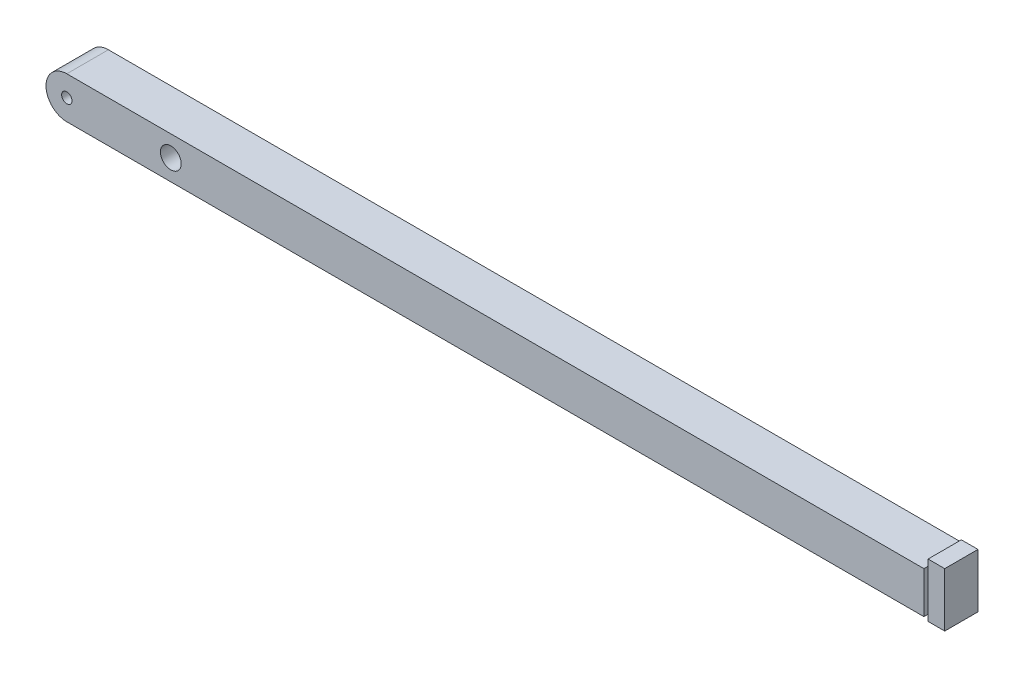
ISO-10303-21;
HEADER;
FILE_DESCRIPTION(('STEP AP214'),'2;1');
FILE_NAME('part.step','',(''),(''),'','','');
FILE_SCHEMA(('AUTOMOTIVE_DESIGN { 1 0 10303 214 1 1 1 1 }'));
ENDSEC;
DATA;
#1=APPLICATION_CONTEXT('core data for automotive mechanical design processes');
#2=APPLICATION_PROTOCOL_DEFINITION('international standard','automotive_design',2000,#1);
#3=PRODUCT_CONTEXT('',#1,'mechanical');
#4=PRODUCT('Part','Part','',(#3));
#5=PRODUCT_RELATED_PRODUCT_CATEGORY('part','',(#4));
#6=PRODUCT_DEFINITION_FORMATION('','',#4);
#7=PRODUCT_DEFINITION_CONTEXT('part definition',#1,'design');
#8=PRODUCT_DEFINITION('design','',#6,#7);
#9=PRODUCT_DEFINITION_SHAPE('','',#8);
#10=(LENGTH_UNIT() NAMED_UNIT(*) SI_UNIT(.MILLI.,.METRE.));
#11=(NAMED_UNIT(*) PLANE_ANGLE_UNIT() SI_UNIT($,.RADIAN.));
#12=(NAMED_UNIT(*) SI_UNIT($,.STERADIAN.) SOLID_ANGLE_UNIT());
#13=UNCERTAINTY_MEASURE_WITH_UNIT(LENGTH_MEASURE(1.E-05),#10,'distance_accuracy_value','');
#14=(GEOMETRIC_REPRESENTATION_CONTEXT(3) GLOBAL_UNCERTAINTY_ASSIGNED_CONTEXT((#13)) GLOBAL_UNIT_ASSIGNED_CONTEXT((#10,
#11,#12)) REPRESENTATION_CONTEXT('',''));
#15=CARTESIAN_POINT('',(0.,0.,0.));
#16=DIRECTION('',(0.,0.,1.));
#17=DIRECTION('',(1.,0.,0.));
#18=AXIS2_PLACEMENT_3D('',#15,#16,#17);
#19=CARTESIAN_POINT('',(0.,7.67322510324858E-12,12.7));
#20=DIRECTION('',(0.,1.,0.));
#21=DIRECTION('',(0.,0.,1.));
#22=AXIS2_PLACEMENT_3D('',#19,#20,#21);
#23=PLANE('',#22);
#24=DIRECTION('',(0.,0.,-1.));
#25=VECTOR('',#24,1.);
#26=CARTESIAN_POINT('',(599.440000000133,7.67322510074029E-12,0.));
#27=LINE('',#26,#25);
#28=CARTESIAN_POINT('',(599.440000000133,7.67322510074029E-12,10.16));
#29=VERTEX_POINT('',#28);
#30=CARTESIAN_POINT('',(599.440000000133,7.67322510074029E-12,-10.16));
#31=VERTEX_POINT('',#30);
#32=EDGE_CURVE('E135',#29,#31,#27,.T.);
#33=ORIENTED_EDGE('',*,*,#32,.F.);
#34=DIRECTION('',(0.,0.,-1.));
#35=VECTOR('',#34,1.);
#36=CARTESIAN_POINT('',(599.440000000133,7.67322510074029E-12,0.));
#37=LINE('',#36,#35);
#38=CARTESIAN_POINT('',(599.440000000133,7.67322510074029E-12,12.7));
#39=VERTEX_POINT('',#38);
#40=EDGE_CURVE('E177',#39,#29,#37,.T.);
#41=ORIENTED_EDGE('',*,*,#40,.F.);
#42=DIRECTION('',(1.,0.,0.));
#43=VECTOR('',#42,1.);
#44=CARTESIAN_POINT('',(0.,7.67322510324858E-12,12.7));
#45=LINE('',#44,#43);
#46=CARTESIAN_POINT('',(76.200000000133,7.237033291704E-11,12.7));
#47=VERTEX_POINT('',#46);
#48=EDGE_CURVE('E203',#47,#39,#45,.T.);
#49=ORIENTED_EDGE('',*,*,#48,.F.);
#50=DIRECTION('',(0.,0.,-1.));
#51=VECTOR('',#50,1.);
#52=CARTESIAN_POINT('',(76.200000000133,7.237033291704E-11,12.7));
#53=LINE('',#52,#51);
#54=CARTESIAN_POINT('',(76.200000000133,7.237033291704E-11,-12.7));
#55=VERTEX_POINT('',#54);
#56=EDGE_CURVE('E46',#47,#55,#53,.T.);
#57=ORIENTED_EDGE('',*,*,#56,.T.);
#58=DIRECTION('',(1.,0.,0.));
#59=VECTOR('',#58,1.);
#60=CARTESIAN_POINT('',(0.,7.67322510324858E-12,-12.7));
#61=LINE('',#60,#59);
#62=CARTESIAN_POINT('',(599.440000000133,7.67322510324858E-12,-12.7));
#63=VERTEX_POINT('',#62);
#64=EDGE_CURVE('E201',#55,#63,#61,.T.);
#65=ORIENTED_EDGE('',*,*,#64,.T.);
#66=DIRECTION('',(0.,0.,-1.));
#67=VECTOR('',#66,1.);
#68=CARTESIAN_POINT('',(599.440000000133,7.67322510074029E-12,0.));
#69=LINE('',#68,#67);
#70=EDGE_CURVE('E53',#31,#63,#69,.T.);
#71=ORIENTED_EDGE('',*,*,#70,.F.);
#72=EDGE_LOOP('',(#33,#41,#49,#57,#65,#71));
#73=FACE_BOUND('',#72,.T.);
#74=ADVANCED_FACE('F38',(#73),#23,.F.);
#75=CARTESIAN_POINT('',(1.28508315100596E-11,25.4000000000462,12.7));
#76=DIRECTION('',(5.05938248426622E-13,1.,0.));
#77=DIRECTION('',(-1.,5.05938248426622E-13,0.));
#78=AXIS2_PLACEMENT_3D('',#75,#76,#77);
#79=PLANE('',#78);
#80=DIRECTION('',(0.,0.,1.));
#81=VECTOR('',#80,1.);
#82=CARTESIAN_POINT('',(599.440000000133,25.4000000000077,0.));
#83=LINE('',#82,#81);
#84=CARTESIAN_POINT('',(599.440000000133,25.4000000000077,10.16));
#85=VERTEX_POINT('',#84);
#86=CARTESIAN_POINT('',(599.440000000133,25.399999999743,12.7));
#87=VERTEX_POINT('',#86);
#88=EDGE_CURVE('E61',#85,#87,#83,.T.);
#89=ORIENTED_EDGE('',*,*,#88,.F.);
#90=DIRECTION('',(0.,0.,1.));
#91=VECTOR('',#90,1.);
#92=CARTESIAN_POINT('',(599.440000000133,25.4000000000077,0.));
#93=LINE('',#92,#91);
#94=CARTESIAN_POINT('',(599.440000000133,25.4000000000077,-10.16));
#95=VERTEX_POINT('',#94);
#96=EDGE_CURVE('E147',#95,#85,#93,.T.);
#97=ORIENTED_EDGE('',*,*,#96,.F.);
#98=DIRECTION('',(0.,0.,1.));
#99=VECTOR('',#98,1.);
#100=CARTESIAN_POINT('',(599.440000000133,25.4000000000077,0.));
#101=LINE('',#100,#99);
#102=CARTESIAN_POINT('',(599.440000000133,25.4000000000077,-12.7));
#103=VERTEX_POINT('',#102);
#104=EDGE_CURVE('E172',#103,#95,#101,.T.);
#105=ORIENTED_EDGE('',*,*,#104,.F.);
#106=DIRECTION('',(1.,-5.05938248426622E-13,0.));
#107=VECTOR('',#106,1.);
#108=CARTESIAN_POINT('',(1.28508315100596E-11,25.4000000000462,-12.7));
#109=LINE('',#108,#107);
#110=CARTESIAN_POINT('',(76.200000000133,25.399999999943,-12.7));
#111=VERTEX_POINT('',#110);
#112=EDGE_CURVE('E194',#111,#103,#109,.T.);
#113=ORIENTED_EDGE('',*,*,#112,.F.);
#114=DIRECTION('',(0.,0.,-1.));
#115=VECTOR('',#114,1.);
#116=CARTESIAN_POINT('',(76.200000000133,25.399999999943,12.7));
#117=LINE('',#116,#115);
#118=CARTESIAN_POINT('',(76.200000000133,25.399999999943,12.7));
#119=VERTEX_POINT('',#118);
#120=EDGE_CURVE('E12',#119,#111,#117,.T.);
#121=ORIENTED_EDGE('',*,*,#120,.F.);
#122=DIRECTION('',(1.,-5.05938248426622E-13,0.));
#123=VECTOR('',#122,1.);
#124=CARTESIAN_POINT('',(1.28508315100596E-11,25.4000000000462,12.7));
#125=LINE('',#124,#123);
#126=EDGE_CURVE('E197',#119,#87,#125,.T.);
#127=ORIENTED_EDGE('',*,*,#126,.T.);
#128=EDGE_LOOP('',(#89,#97,#105,#113,#121,#127));
#129=FACE_BOUND('',#128,.T.);
#130=ADVANCED_FACE('F40',(#129),#79,.T.);
#131=CARTESIAN_POINT('',(609.600000000133,0.,12.7));
#132=DIRECTION('',(1.,0.,0.));
#133=DIRECTION('',(0.,0.,-1.));
#134=AXIS2_PLACEMENT_3D('',#131,#132,#133);
#135=PLANE('',#134);
#136=DIRECTION('',(0.,1.,0.));
#137=VECTOR('',#136,1.);
#138=CARTESIAN_POINT('',(609.600000000133,0.,10.16));
#139=LINE('',#138,#137);
#140=CARTESIAN_POINT('',(609.600000000133,-3.81,10.16));
#141=VERTEX_POINT('',#140);
#142=CARTESIAN_POINT('',(609.600000000133,29.2100000000077,10.16));
#143=VERTEX_POINT('',#142);
#144=EDGE_CURVE('E175',#141,#143,#139,.T.);
#145=ORIENTED_EDGE('',*,*,#144,.F.);
#146=DIRECTION('',(0.,0.,-1.));
#147=VECTOR('',#146,1.);
#148=CARTESIAN_POINT('',(609.600000000133,-3.81,0.));
#149=LINE('',#148,#147);
#150=CARTESIAN_POINT('',(609.600000000133,-3.81,-10.16));
#151=VERTEX_POINT('',#150);
#152=EDGE_CURVE('E123',#141,#151,#149,.T.);
#153=ORIENTED_EDGE('',*,*,#152,.T.);
#154=DIRECTION('',(0.,1.,0.));
#155=VECTOR('',#154,1.);
#156=CARTESIAN_POINT('',(609.600000000133,0.,-10.16));
#157=LINE('',#156,#155);
#158=CARTESIAN_POINT('',(609.600000000133,29.2100000000077,-10.16));
#159=VERTEX_POINT('',#158);
#160=EDGE_CURVE('E163',#151,#159,#157,.T.);
#161=ORIENTED_EDGE('',*,*,#160,.T.);
#162=DIRECTION('',(0.,0.,-1.));
#163=VECTOR('',#162,1.);
#164=CARTESIAN_POINT('',(609.600000000133,29.2100000000077,0.));
#165=LINE('',#164,#163);
#166=EDGE_CURVE('E145',#143,#159,#165,.T.);
#167=ORIENTED_EDGE('',*,*,#166,.F.);
#168=EDGE_LOOP('',(#145,#153,#161,#167));
#169=FACE_BOUND('',#168,.T.);
#170=ADVANCED_FACE('F251',(#169),#135,.T.);
#171=CARTESIAN_POINT('',(0.,0.,-12.7));
#172=DIRECTION('',(0.,0.,1.));
#173=DIRECTION('',(1.,0.,0.));
#174=AXIS2_PLACEMENT_3D('',#171,#172,#173);
#175=PLANE('',#174);
#176=CARTESIAN_POINT('',(76.200000000133,12.7000000000077,-12.7));
#177=DIRECTION('',(0.,0.,1.));
#178=DIRECTION('',(1.,0.,0.));
#179=AXIS2_PLACEMENT_3D('',#176,#177,#178);
#180=CIRCLE('',#179,3.1749999998706);
#181=CARTESIAN_POINT('',(79.3750000000036,12.7000000000077,-12.7));
#182=VERTEX_POINT('',#181);
#183=EDGE_CURVE('E191',#182,#182,#180,.T.);
#184=ORIENTED_EDGE('',*,*,#183,.T.);
#185=EDGE_LOOP('',(#184));
#186=FACE_BOUND('',#185,.T.);
#187=CARTESIAN_POINT('',(139.699994311699,12.6999999999768,-12.7));
#188=DIRECTION('',(0.,0.,1.));
#189=DIRECTION('',(1.,0.,0.));
#190=AXIS2_PLACEMENT_3D('',#187,#188,#189);
#191=CIRCLE('',#190,6.35);
#192=CARTESIAN_POINT('',(146.049994311699,12.6999999999768,-12.7));
#193=VERTEX_POINT('',#192);
#194=EDGE_CURVE('E183',#193,#193,#191,.T.);
#195=ORIENTED_EDGE('',*,*,#194,.T.);
#196=EDGE_LOOP('',(#195));
#197=FACE_BOUND('',#196,.T.);
#198=DIRECTION('',(0.,1.,0.));
#199=VECTOR('',#198,1.);
#200=CARTESIAN_POINT('',(599.440000000133,0.,-12.7));
#201=LINE('',#200,#199);
#202=EDGE_CURVE('E170',#63,#103,#201,.T.);
#203=ORIENTED_EDGE('',*,*,#202,.F.);
#204=ORIENTED_EDGE('',*,*,#64,.F.);
#205=CARTESIAN_POINT('',(76.200000000133,12.7000000000077,-12.7));
#206=DIRECTION('',(0.,0.,1.));
#207=DIRECTION('',(1.,0.,0.));
#208=AXIS2_PLACEMENT_3D('',#205,#206,#207);
#209=CIRCLE('',#208,12.6999999998706);
#210=EDGE_CURVE('E208',#111,#55,#209,.T.);
#211=ORIENTED_EDGE('',*,*,#210,.F.);
#212=ORIENTED_EDGE('',*,*,#112,.T.);
#213=EDGE_LOOP('',(#203,#204,#211,#212));
#214=FACE_BOUND('',#213,.T.);
#215=ADVANCED_FACE('F221',(#186,#197,#214),#175,.F.);
#216=CARTESIAN_POINT('',(0.,0.,12.7));
#217=DIRECTION('',(0.,0.,1.));
#218=DIRECTION('',(1.,0.,0.));
#219=AXIS2_PLACEMENT_3D('',#216,#217,#218);
#220=PLANE('',#219);
#221=CARTESIAN_POINT('',(76.200000000133,12.7000000000077,12.7));
#222=DIRECTION('',(0.,0.,1.));
#223=DIRECTION('',(1.,0.,0.));
#224=AXIS2_PLACEMENT_3D('',#221,#222,#223);
#225=CIRCLE('',#224,3.1749999998706);
#226=CARTESIAN_POINT('',(79.3750000000036,12.7000000000077,12.7));
#227=VERTEX_POINT('',#226);
#228=EDGE_CURVE('E188',#227,#227,#225,.T.);
#229=ORIENTED_EDGE('',*,*,#228,.F.);
#230=EDGE_LOOP('',(#229));
#231=FACE_BOUND('',#230,.T.);
#232=CARTESIAN_POINT('',(139.699994311699,12.6999999999768,12.7));
#233=DIRECTION('',(0.,0.,1.));
#234=DIRECTION('',(1.,0.,0.));
#235=AXIS2_PLACEMENT_3D('',#232,#233,#234);
#236=CIRCLE('',#235,6.35);
#237=CARTESIAN_POINT('',(146.049994311699,12.6999999999768,12.7));
#238=VERTEX_POINT('',#237);
#239=EDGE_CURVE('E185',#238,#238,#236,.T.);
#240=ORIENTED_EDGE('',*,*,#239,.F.);
#241=EDGE_LOOP('',(#240));
#242=FACE_BOUND('',#241,.T.);
#243=ORIENTED_EDGE('',*,*,#48,.T.);
#244=DIRECTION('',(0.,-1.,0.));
#245=VECTOR('',#244,1.);
#246=CARTESIAN_POINT('',(599.440000000133,0.,12.7));
#247=LINE('',#246,#245);
#248=EDGE_CURVE('E181',#87,#39,#247,.T.);
#249=ORIENTED_EDGE('',*,*,#248,.F.);
#250=ORIENTED_EDGE('',*,*,#126,.F.);
#251=CARTESIAN_POINT('',(76.200000000133,12.7000000000077,12.7));
#252=DIRECTION('',(0.,0.,1.));
#253=DIRECTION('',(1.,0.,0.));
#254=AXIS2_PLACEMENT_3D('',#251,#252,#253);
#255=CIRCLE('',#254,12.6999999998706);
#256=EDGE_CURVE('E200',#119,#47,#255,.T.);
#257=ORIENTED_EDGE('',*,*,#256,.T.);
#258=EDGE_LOOP('',(#243,#249,#250,#257));
#259=FACE_BOUND('',#258,.T.);
#260=ADVANCED_FACE('F232',(#231,#242,#259),#220,.T.);
#261=CARTESIAN_POINT('',(76.200000000133,12.7000000000077,12.7));
#262=DIRECTION('',(0.,0.,-1.));
#263=DIRECTION('',(-1.,0.,0.));
#264=AXIS2_PLACEMENT_3D('',#261,#262,#263);
#265=CYLINDRICAL_SURFACE('',#264,12.6999999998706);
#266=ORIENTED_EDGE('',*,*,#210,.T.);
#267=ORIENTED_EDGE('',*,*,#56,.F.);
#268=ORIENTED_EDGE('',*,*,#256,.F.);
#269=ORIENTED_EDGE('',*,*,#120,.T.);
#270=EDGE_LOOP('',(#266,#267,#268,#269));
#271=FACE_BOUND('',#270,.T.);
#272=ADVANCED_FACE('F234',(#271),#265,.T.);
#273=CARTESIAN_POINT('',(76.200000000133,12.7000000000077,-12.7));
#274=DIRECTION('',(0.,0.,1.));
#275=DIRECTION('',(1.,0.,0.));
#276=AXIS2_PLACEMENT_3D('',#273,#274,#275);
#277=CYLINDRICAL_SURFACE('',#276,3.1749999998706);
#278=ORIENTED_EDGE('',*,*,#183,.F.);
#279=EDGE_LOOP('',(#278));
#280=FACE_BOUND('',#279,.T.);
#281=ORIENTED_EDGE('',*,*,#228,.T.);
#282=EDGE_LOOP('',(#281));
#283=FACE_BOUND('',#282,.T.);
#284=ADVANCED_FACE('F236',(#280,#283),#277,.F.);
#285=CARTESIAN_POINT('',(139.699994311699,12.6999999999768,-12.7));
#286=DIRECTION('',(0.,0.,1.));
#287=DIRECTION('',(1.,0.,0.));
#288=AXIS2_PLACEMENT_3D('',#285,#286,#287);
#289=CYLINDRICAL_SURFACE('',#288,6.35);
#290=ORIENTED_EDGE('',*,*,#194,.F.);
#291=EDGE_LOOP('',(#290));
#292=FACE_BOUND('',#291,.T.);
#293=ORIENTED_EDGE('',*,*,#239,.T.);
#294=EDGE_LOOP('',(#293));
#295=FACE_BOUND('',#294,.T.);
#296=ADVANCED_FACE('F241',(#292,#295),#289,.F.);
#297=CARTESIAN_POINT('',(599.440000000133,0.,10.16));
#298=DIRECTION('',(0.,0.,-1.));
#299=DIRECTION('',(-1.,0.,0.));
#300=AXIS2_PLACEMENT_3D('',#297,#298,#299);
#301=PLANE('',#300);
#302=ORIENTED_EDGE('',*,*,#144,.T.);
#303=DIRECTION('',(1.,0.,0.));
#304=VECTOR('',#303,1.);
#305=CARTESIAN_POINT('',(599.440000000133,29.2100000000077,10.16));
#306=LINE('',#305,#304);
#307=CARTESIAN_POINT('',(599.440000000133,29.2100000000077,10.16));
#308=VERTEX_POINT('',#307);
#309=EDGE_CURVE('E160',#308,#143,#306,.T.);
#310=ORIENTED_EDGE('',*,*,#309,.F.);
#311=DIRECTION('',(0.,1.,0.));
#312=VECTOR('',#311,1.);
#313=CARTESIAN_POINT('',(599.440000000133,0.,10.16));
#314=LINE('',#313,#312);
#315=EDGE_CURVE('E155',#85,#308,#314,.T.);
#316=ORIENTED_EDGE('',*,*,#315,.F.);
#317=DIRECTION('',(0.,1.,0.));
#318=VECTOR('',#317,1.);
#319=CARTESIAN_POINT('',(599.440000000133,0.,10.16));
#320=LINE('',#319,#318);
#321=EDGE_CURVE('E131',#29,#85,#320,.T.);
#322=ORIENTED_EDGE('',*,*,#321,.F.);
#323=DIRECTION('',(0.,-1.,0.));
#324=VECTOR('',#323,1.);
#325=CARTESIAN_POINT('',(599.440000000133,0.,10.16));
#326=LINE('',#325,#324);
#327=CARTESIAN_POINT('',(599.440000000133,-3.81,10.16));
#328=VERTEX_POINT('',#327);
#329=EDGE_CURVE('E129',#29,#328,#326,.T.);
#330=ORIENTED_EDGE('',*,*,#329,.T.);
#331=DIRECTION('',(1.,0.,0.));
#332=VECTOR('',#331,1.);
#333=CARTESIAN_POINT('',(599.440000000133,-3.81,10.16));
#334=LINE('',#333,#332);
#335=EDGE_CURVE('E116',#328,#141,#334,.T.);
#336=ORIENTED_EDGE('',*,*,#335,.T.);
#337=EDGE_LOOP('',(#302,#310,#316,#322,#330,#336));
#338=FACE_BOUND('',#337,.T.);
#339=ADVANCED_FACE('F130',(#338),#301,.F.);
#340=CARTESIAN_POINT('',(599.440000000133,0.,0.));
#341=DIRECTION('',(1.,0.,0.));
#342=DIRECTION('',(0.,0.,-1.));
#343=AXIS2_PLACEMENT_3D('',#340,#341,#342);
#344=PLANE('',#343);
#345=ORIENTED_EDGE('',*,*,#40,.T.);
#346=ORIENTED_EDGE('',*,*,#321,.T.);
#347=ORIENTED_EDGE('',*,*,#88,.T.);
#348=ORIENTED_EDGE('',*,*,#248,.T.);
#349=EDGE_LOOP('',(#345,#346,#347,#348));
#350=FACE_BOUND('',#349,.T.);
#351=ADVANCED_FACE('F264',(#350),#344,.T.);
#352=CARTESIAN_POINT('',(599.440000000133,0.,-10.16));
#353=DIRECTION('',(0.,0.,-1.));
#354=DIRECTION('',(-1.,0.,0.));
#355=AXIS2_PLACEMENT_3D('',#352,#353,#354);
#356=PLANE('',#355);
#357=ORIENTED_EDGE('',*,*,#160,.F.);
#358=DIRECTION('',(1.,0.,0.));
#359=VECTOR('',#358,1.);
#360=CARTESIAN_POINT('',(599.440000000133,-3.81,-10.16));
#361=LINE('',#360,#359);
#362=CARTESIAN_POINT('',(599.440000000133,-3.81,-10.16));
#363=VERTEX_POINT('',#362);
#364=EDGE_CURVE('E125',#363,#151,#361,.T.);
#365=ORIENTED_EDGE('',*,*,#364,.F.);
#366=DIRECTION('',(0.,-1.,0.));
#367=VECTOR('',#366,1.);
#368=CARTESIAN_POINT('',(599.440000000133,0.,-10.16));
#369=LINE('',#368,#367);
#370=EDGE_CURVE('E139',#31,#363,#369,.T.);
#371=ORIENTED_EDGE('',*,*,#370,.F.);
#372=DIRECTION('',(0.,1.,0.));
#373=VECTOR('',#372,1.);
#374=CARTESIAN_POINT('',(599.440000000133,0.,-10.16));
#375=LINE('',#374,#373);
#376=EDGE_CURVE('E166',#31,#95,#375,.T.);
#377=ORIENTED_EDGE('',*,*,#376,.T.);
#378=DIRECTION('',(0.,1.,0.));
#379=VECTOR('',#378,1.);
#380=CARTESIAN_POINT('',(599.440000000133,0.,-10.16));
#381=LINE('',#380,#379);
#382=CARTESIAN_POINT('',(599.440000000133,29.2100000000077,-10.16));
#383=VERTEX_POINT('',#382);
#384=EDGE_CURVE('E150',#95,#383,#381,.T.);
#385=ORIENTED_EDGE('',*,*,#384,.T.);
#386=DIRECTION('',(1.,0.,0.));
#387=VECTOR('',#386,1.);
#388=CARTESIAN_POINT('',(599.440000000133,29.2100000000077,-10.16));
#389=LINE('',#388,#387);
#390=EDGE_CURVE('E157',#383,#159,#389,.T.);
#391=ORIENTED_EDGE('',*,*,#390,.T.);
#392=EDGE_LOOP('',(#357,#365,#371,#377,#385,#391));
#393=FACE_BOUND('',#392,.T.);
#394=ADVANCED_FACE('F229',(#393),#356,.T.);
#395=CARTESIAN_POINT('',(599.440000000133,0.,0.));
#396=DIRECTION('',(1.,0.,0.));
#397=DIRECTION('',(0.,0.,-1.));
#398=AXIS2_PLACEMENT_3D('',#395,#396,#397);
#399=PLANE('',#398);
#400=ORIENTED_EDGE('',*,*,#376,.F.);
#401=ORIENTED_EDGE('',*,*,#70,.T.);
#402=ORIENTED_EDGE('',*,*,#202,.T.);
#403=ORIENTED_EDGE('',*,*,#104,.T.);
#404=EDGE_LOOP('',(#400,#401,#402,#403));
#405=FACE_BOUND('',#404,.T.);
#406=ADVANCED_FACE('F224',(#405),#399,.T.);
#407=CARTESIAN_POINT('',(599.440000000133,29.2100000000077,0.));
#408=DIRECTION('',(0.,-1.,0.));
#409=DIRECTION('',(0.,0.,-1.));
#410=AXIS2_PLACEMENT_3D('',#407,#408,#409);
#411=PLANE('',#410);
#412=ORIENTED_EDGE('',*,*,#166,.T.);
#413=ORIENTED_EDGE('',*,*,#390,.F.);
#414=DIRECTION('',(0.,0.,-1.));
#415=VECTOR('',#414,1.);
#416=CARTESIAN_POINT('',(599.440000000133,29.2100000000077,0.));
#417=LINE('',#416,#415);
#418=EDGE_CURVE('E153',#308,#383,#417,.T.);
#419=ORIENTED_EDGE('',*,*,#418,.F.);
#420=ORIENTED_EDGE('',*,*,#309,.T.);
#421=EDGE_LOOP('',(#412,#413,#419,#420));
#422=FACE_BOUND('',#421,.T.);
#423=ADVANCED_FACE('F271',(#422),#411,.F.);
#424=CARTESIAN_POINT('',(599.440000000133,0.,0.));
#425=DIRECTION('',(1.,0.,0.));
#426=DIRECTION('',(0.,0.,-1.));
#427=AXIS2_PLACEMENT_3D('',#424,#425,#426);
#428=PLANE('',#427);
#429=ORIENTED_EDGE('',*,*,#96,.T.);
#430=ORIENTED_EDGE('',*,*,#315,.T.);
#431=ORIENTED_EDGE('',*,*,#418,.T.);
#432=ORIENTED_EDGE('',*,*,#384,.F.);
#433=EDGE_LOOP('',(#429,#430,#431,#432));
#434=FACE_BOUND('',#433,.T.);
#435=ADVANCED_FACE('F274',(#434),#428,.F.);
#436=CARTESIAN_POINT('',(599.440000000133,-3.81,0.));
#437=DIRECTION('',(0.,-1.,0.));
#438=DIRECTION('',(0.,0.,-1.));
#439=AXIS2_PLACEMENT_3D('',#436,#437,#438);
#440=PLANE('',#439);
#441=ORIENTED_EDGE('',*,*,#152,.F.);
#442=ORIENTED_EDGE('',*,*,#335,.F.);
#443=DIRECTION('',(0.,0.,-1.));
#444=VECTOR('',#443,1.);
#445=CARTESIAN_POINT('',(599.440000000133,-3.81,0.));
#446=LINE('',#445,#444);
#447=EDGE_CURVE('E121',#328,#363,#446,.T.);
#448=ORIENTED_EDGE('',*,*,#447,.T.);
#449=ORIENTED_EDGE('',*,*,#364,.T.);
#450=EDGE_LOOP('',(#441,#442,#448,#449));
#451=FACE_BOUND('',#450,.T.);
#452=ADVANCED_FACE('F118',(#451),#440,.T.);
#453=CARTESIAN_POINT('',(599.440000000133,0.,0.));
#454=DIRECTION('',(1.,0.,0.));
#455=DIRECTION('',(0.,0.,-1.));
#456=AXIS2_PLACEMENT_3D('',#453,#454,#455);
#457=PLANE('',#456);
#458=ORIENTED_EDGE('',*,*,#370,.T.);
#459=ORIENTED_EDGE('',*,*,#447,.F.);
#460=ORIENTED_EDGE('',*,*,#329,.F.);
#461=ORIENTED_EDGE('',*,*,#32,.T.);
#462=EDGE_LOOP('',(#458,#459,#460,#461));
#463=FACE_BOUND('',#462,.T.);
#464=ADVANCED_FACE('F137',(#463),#457,.F.);
#465=CLOSED_SHELL('',(#74,#130,#170,#215,#260,#272,#284,#296,#339,#351,#394,#406,#423,#435,#452,#464));
#466=MANIFOLD_SOLID_BREP('B2',#465);
#467=ADVANCED_BREP_SHAPE_REPRESENTATION('',(#18,#466),#14);
#468=SHAPE_DEFINITION_REPRESENTATION(#9,#467);
ENDSEC;
END-ISO-10303-21;
